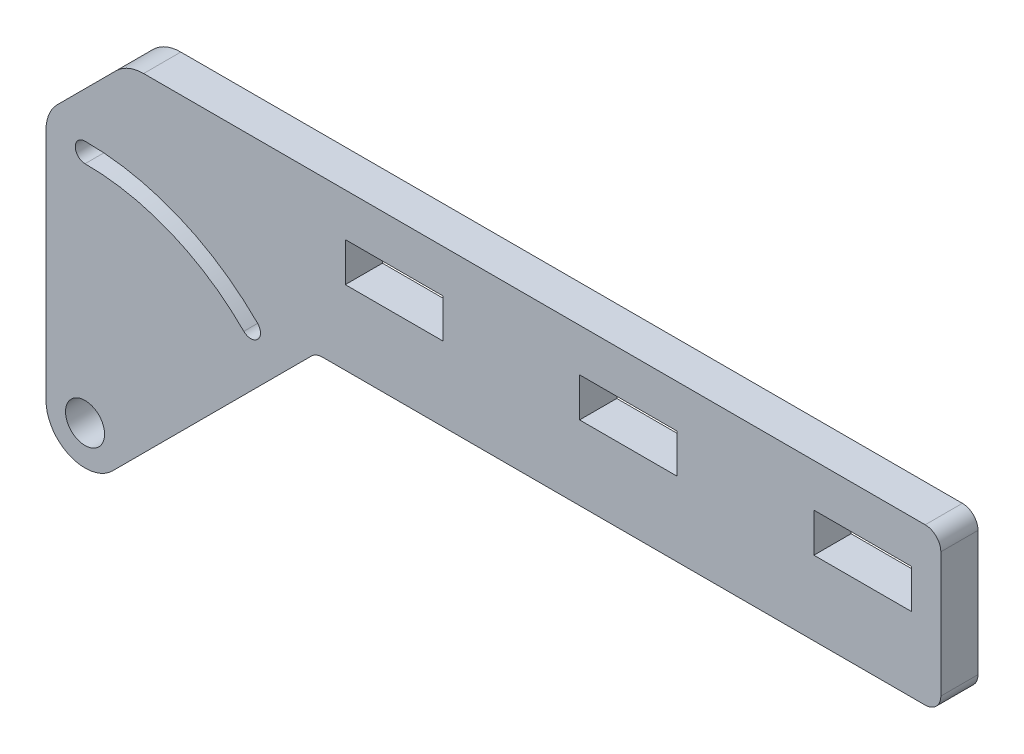
ISO-10303-21;
HEADER;
FILE_DESCRIPTION(('STEP AP214'),'2;1');
FILE_NAME('part.step','',(''),(''),'','','');
FILE_SCHEMA(('AUTOMOTIVE_DESIGN { 1 0 10303 214 1 1 1 1 }'));
ENDSEC;
DATA;
#1=APPLICATION_CONTEXT('core data for automotive mechanical design processes');
#2=APPLICATION_PROTOCOL_DEFINITION('international standard','automotive_design',2000,#1);
#3=PRODUCT_CONTEXT('',#1,'mechanical');
#4=PRODUCT('Part','Part','',(#3));
#5=PRODUCT_RELATED_PRODUCT_CATEGORY('part','',(#4));
#6=PRODUCT_DEFINITION_FORMATION('','',#4);
#7=PRODUCT_DEFINITION_CONTEXT('part definition',#1,'design');
#8=PRODUCT_DEFINITION('design','',#6,#7);
#9=PRODUCT_DEFINITION_SHAPE('','',#8);
#10=(LENGTH_UNIT() NAMED_UNIT(*) SI_UNIT(.MILLI.,.METRE.));
#11=(NAMED_UNIT(*) PLANE_ANGLE_UNIT() SI_UNIT($,.RADIAN.));
#12=(NAMED_UNIT(*) SI_UNIT($,.STERADIAN.) SOLID_ANGLE_UNIT());
#13=UNCERTAINTY_MEASURE_WITH_UNIT(LENGTH_MEASURE(1.E-05),#10,'distance_accuracy_value','');
#14=(GEOMETRIC_REPRESENTATION_CONTEXT(3) GLOBAL_UNCERTAINTY_ASSIGNED_CONTEXT((#13)) GLOBAL_UNIT_ASSIGNED_CONTEXT((#10,
#11,#12)) REPRESENTATION_CONTEXT('',''));
#15=CARTESIAN_POINT('',(0.,0.,0.));
#16=DIRECTION('',(0.,0.,1.));
#17=DIRECTION('',(1.,0.,0.));
#18=AXIS2_PLACEMENT_3D('',#15,#16,#17);
#19=CARTESIAN_POINT('',(139.155256121069,0.,6.0452));
#20=DIRECTION('',(-1.,0.,0.));
#21=DIRECTION('',(0.,0.,1.));
#22=AXIS2_PLACEMENT_3D('',#19,#20,#21);
#23=PLANE('',#22);
#24=DIRECTION('',(0.,1.,0.));
#25=VECTOR('',#24,1.);
#26=CARTESIAN_POINT('',(139.155256121069,0.,0.));
#27=LINE('',#26,#25);
#28=CARTESIAN_POINT('',(139.155256121069,31.115,0.));
#29=VERTEX_POINT('',#28);
#30=CARTESIAN_POINT('',(139.155256121069,51.435,0.));
#31=VERTEX_POINT('',#30);
#32=EDGE_CURVE('E454',#29,#31,#27,.T.);
#33=ORIENTED_EDGE('',*,*,#32,.T.);
#34=DIRECTION('',(0.,0.,-1.));
#35=VECTOR('',#34,1.);
#36=CARTESIAN_POINT('',(139.155256121069,51.435,6.0452));
#37=LINE('',#36,#35);
#38=CARTESIAN_POINT('',(139.155256121069,51.435,6.0452));
#39=VERTEX_POINT('',#38);
#40=EDGE_CURVE('E11',#39,#31,#37,.T.);
#41=ORIENTED_EDGE('',*,*,#40,.F.);
#42=DIRECTION('',(0.,1.,0.));
#43=VECTOR('',#42,1.);
#44=CARTESIAN_POINT('',(139.155256121069,0.,6.0452));
#45=LINE('',#44,#43);
#46=CARTESIAN_POINT('',(139.155256121069,31.115,6.0452));
#47=VERTEX_POINT('',#46);
#48=EDGE_CURVE('E393',#47,#39,#45,.T.);
#49=ORIENTED_EDGE('',*,*,#48,.F.);
#50=DIRECTION('',(0.,0.,-1.));
#51=VECTOR('',#50,1.);
#52=CARTESIAN_POINT('',(139.155256121069,31.115,6.0452));
#53=LINE('',#52,#51);
#54=EDGE_CURVE('E496',#47,#29,#53,.T.);
#55=ORIENTED_EDGE('',*,*,#54,.T.);
#56=EDGE_LOOP('',(#33,#41,#49,#55));
#57=FACE_BOUND('',#56,.T.);
#58=ADVANCED_FACE('F47',(#57),#23,.F.);
#59=CARTESIAN_POINT('',(136.615256121069,51.435,6.0452));
#60=DIRECTION('',(0.,0.,-1.));
#61=DIRECTION('',(-1.,0.,0.));
#62=AXIS2_PLACEMENT_3D('',#59,#60,#61);
#63=CYLINDRICAL_SURFACE('',#62,2.53999999999999);
#64=CARTESIAN_POINT('',(136.615256121069,51.435,0.));
#65=DIRECTION('',(0.,0.,1.));
#66=DIRECTION('',(1.,0.,0.));
#67=AXIS2_PLACEMENT_3D('',#64,#65,#66);
#68=CIRCLE('',#67,2.53999999999999);
#69=CARTESIAN_POINT('',(136.615256121069,53.975,0.));
#70=VERTEX_POINT('',#69);
#71=EDGE_CURVE('E458',#31,#70,#68,.T.);
#72=ORIENTED_EDGE('',*,*,#71,.T.);
#73=DIRECTION('',(0.,0.,-1.));
#74=VECTOR('',#73,1.);
#75=CARTESIAN_POINT('',(136.615256121069,53.975,6.0452));
#76=LINE('',#75,#74);
#77=CARTESIAN_POINT('',(136.615256121069,53.975,6.0452));
#78=VERTEX_POINT('',#77);
#79=EDGE_CURVE('E57',#78,#70,#76,.T.);
#80=ORIENTED_EDGE('',*,*,#79,.F.);
#81=CARTESIAN_POINT('',(136.615256121069,51.435,6.0452));
#82=DIRECTION('',(0.,0.,1.));
#83=DIRECTION('',(1.,0.,0.));
#84=AXIS2_PLACEMENT_3D('',#81,#82,#83);
#85=CIRCLE('',#84,2.53999999999999);
#86=EDGE_CURVE('E397',#39,#78,#85,.T.);
#87=ORIENTED_EDGE('',*,*,#86,.F.);
#88=ORIENTED_EDGE('',*,*,#40,.T.);
#89=EDGE_LOOP('',(#72,#80,#87,#88));
#90=FACE_BOUND('',#89,.T.);
#91=ADVANCED_FACE('F574',(#90),#63,.T.);
#92=CARTESIAN_POINT('',(0.,53.975,6.0452));
#93=DIRECTION('',(0.,-1.,0.));
#94=DIRECTION('',(1.,0.,0.));
#95=AXIS2_PLACEMENT_3D('',#92,#93,#94);
#96=PLANE('',#95);
#97=DIRECTION('',(-1.,0.,0.));
#98=VECTOR('',#97,1.);
#99=CARTESIAN_POINT('',(0.,53.975,0.));
#100=LINE('',#99,#98);
#101=CARTESIAN_POINT('',(9.52500000000008,53.975,0.));
#102=VERTEX_POINT('',#101);
#103=EDGE_CURVE('E461',#70,#102,#100,.T.);
#104=ORIENTED_EDGE('',*,*,#103,.T.);
#105=DIRECTION('',(0.,0.,-1.));
#106=VECTOR('',#105,1.);
#107=CARTESIAN_POINT('',(9.52500000000008,53.975,6.0452));
#108=LINE('',#107,#106);
#109=CARTESIAN_POINT('',(9.52500000000008,53.975,6.0452));
#110=VERTEX_POINT('',#109);
#111=EDGE_CURVE('E527',#110,#102,#108,.T.);
#112=ORIENTED_EDGE('',*,*,#111,.F.);
#113=DIRECTION('',(-1.,0.,0.));
#114=VECTOR('',#113,1.);
#115=CARTESIAN_POINT('',(0.,53.975,6.0452));
#116=LINE('',#115,#114);
#117=EDGE_CURVE('E400',#78,#110,#116,.T.);
#118=ORIENTED_EDGE('',*,*,#117,.F.);
#119=ORIENTED_EDGE('',*,*,#79,.T.);
#120=EDGE_LOOP('',(#104,#112,#118,#119));
#121=FACE_BOUND('',#120,.T.);
#122=ADVANCED_FACE('F579',(#121),#96,.F.);
#123=CARTESIAN_POINT('',(9.52500000000007,47.625,6.0452));
#124=DIRECTION('',(0.,0.,-1.));
#125=DIRECTION('',(-1.,0.,0.));
#126=AXIS2_PLACEMENT_3D('',#123,#124,#125);
#127=CYLINDRICAL_SURFACE('',#126,6.35);
#128=CARTESIAN_POINT('',(9.52500000000007,47.625,0.));
#129=DIRECTION('',(0.,0.,1.));
#130=DIRECTION('',(1.,0.,0.));
#131=AXIS2_PLACEMENT_3D('',#128,#129,#130);
#132=CIRCLE('',#131,6.35);
#133=CARTESIAN_POINT('',(5.03487193946552,52.1151280605346,0.));
#134=VERTEX_POINT('',#133);
#135=EDGE_CURVE('E465',#134,#102,#132,.F.);
#136=ORIENTED_EDGE('',*,*,#135,.F.);
#137=DIRECTION('',(0.,0.,-1.));
#138=VECTOR('',#137,1.);
#139=CARTESIAN_POINT('',(5.03487193946552,52.1151280605346,6.0452));
#140=LINE('',#139,#138);
#141=CARTESIAN_POINT('',(5.03487193946552,52.1151280605346,6.0452));
#142=VERTEX_POINT('',#141);
#143=EDGE_CURVE('E524',#142,#134,#140,.T.);
#144=ORIENTED_EDGE('',*,*,#143,.F.);
#145=CARTESIAN_POINT('',(9.52500000000007,47.625,6.0452));
#146=DIRECTION('',(0.,0.,1.));
#147=DIRECTION('',(1.,0.,0.));
#148=AXIS2_PLACEMENT_3D('',#145,#146,#147);
#149=CIRCLE('',#148,6.35);
#150=EDGE_CURVE('E403',#142,#110,#149,.F.);
#151=ORIENTED_EDGE('',*,*,#150,.T.);
#152=ORIENTED_EDGE('',*,*,#111,.T.);
#153=EDGE_LOOP('',(#136,#144,#151,#152));
#154=FACE_BOUND('',#153,.T.);
#155=ADVANCED_FACE('F617',(#154),#127,.T.);
#156=CARTESIAN_POINT('',(-23.5401280605346,23.5401280605348,6.0452));
#157=DIRECTION('',(-0.707106781186544,0.707106781186551,0.));
#158=DIRECTION('',(-0.707106781186551,-0.707106781186544,0.));
#159=AXIS2_PLACEMENT_3D('',#156,#157,#158);
#160=PLANE('',#159);
#161=DIRECTION('',(0.707106781186551,0.707106781186544,0.));
#162=VECTOR('',#161,1.);
#163=CARTESIAN_POINT('',(-23.5401280605346,23.5401280605348,0.));
#164=LINE('',#163,#162);
#165=CARTESIAN_POINT('',(-4.49012806053456,42.5901280605346,0.));
#166=VERTEX_POINT('',#165);
#167=EDGE_CURVE('E469',#166,#134,#164,.T.);
#168=ORIENTED_EDGE('',*,*,#167,.F.);
#169=DIRECTION('',(0.,0.,-1.));
#170=VECTOR('',#169,1.);
#171=CARTESIAN_POINT('',(-4.49012806053456,42.5901280605346,6.0452));
#172=LINE('',#171,#170);
#173=CARTESIAN_POINT('',(-4.49012806053456,42.5901280605346,6.0452));
#174=VERTEX_POINT('',#173);
#175=EDGE_CURVE('E521',#174,#166,#172,.T.);
#176=ORIENTED_EDGE('',*,*,#175,.F.);
#177=DIRECTION('',(0.707106781186551,0.707106781186544,0.));
#178=VECTOR('',#177,1.);
#179=CARTESIAN_POINT('',(-23.5401280605346,23.5401280605348,6.0452));
#180=LINE('',#179,#178);
#181=EDGE_CURVE('E407',#174,#142,#180,.T.);
#182=ORIENTED_EDGE('',*,*,#181,.T.);
#183=ORIENTED_EDGE('',*,*,#143,.T.);
#184=EDGE_LOOP('',(#168,#176,#182,#183));
#185=FACE_BOUND('',#184,.T.);
#186=ADVANCED_FACE('F586',(#185),#160,.T.);
#187=CARTESIAN_POINT('',(0.,38.1,6.0452));
#188=DIRECTION('',(0.,0.,-1.));
#189=DIRECTION('',(-1.,0.,0.));
#190=AXIS2_PLACEMENT_3D('',#187,#188,#189);
#191=CYLINDRICAL_SURFACE('',#190,6.35);
#192=CARTESIAN_POINT('',(0.,38.1,0.));
#193=DIRECTION('',(0.,0.,1.));
#194=DIRECTION('',(1.,0.,0.));
#195=AXIS2_PLACEMENT_3D('',#192,#193,#194);
#196=CIRCLE('',#195,6.35);
#197=CARTESIAN_POINT('',(-6.35,38.1,0.));
#198=VERTEX_POINT('',#197);
#199=EDGE_CURVE('E473',#198,#166,#196,.F.);
#200=ORIENTED_EDGE('',*,*,#199,.F.);
#201=DIRECTION('',(0.,0.,-1.));
#202=VECTOR('',#201,1.);
#203=CARTESIAN_POINT('',(-6.35,38.1,6.0452));
#204=LINE('',#203,#202);
#205=CARTESIAN_POINT('',(-6.35,38.1,6.0452));
#206=VERTEX_POINT('',#205);
#207=EDGE_CURVE('E518',#206,#198,#204,.T.);
#208=ORIENTED_EDGE('',*,*,#207,.F.);
#209=CARTESIAN_POINT('',(0.,38.1,6.0452));
#210=DIRECTION('',(0.,0.,1.));
#211=DIRECTION('',(1.,0.,0.));
#212=AXIS2_PLACEMENT_3D('',#209,#210,#211);
#213=CIRCLE('',#212,6.35);
#214=EDGE_CURVE('E411',#206,#174,#213,.F.);
#215=ORIENTED_EDGE('',*,*,#214,.T.);
#216=ORIENTED_EDGE('',*,*,#175,.T.);
#217=EDGE_LOOP('',(#200,#208,#215,#216));
#218=FACE_BOUND('',#217,.T.);
#219=ADVANCED_FACE('F590',(#218),#191,.T.);
#220=CARTESIAN_POINT('',(-6.35,0.,6.0452));
#221=DIRECTION('',(1.,0.,0.));
#222=DIRECTION('',(0.,1.,0.));
#223=AXIS2_PLACEMENT_3D('',#220,#221,#222);
#224=PLANE('',#223);
#225=DIRECTION('',(0.,-1.,0.));
#226=VECTOR('',#225,1.);
#227=CARTESIAN_POINT('',(-6.35,0.,0.));
#228=LINE('',#227,#226);
#229=CARTESIAN_POINT('',(-6.35,0.,0.));
#230=VERTEX_POINT('',#229);
#231=EDGE_CURVE('E477',#198,#230,#228,.T.);
#232=ORIENTED_EDGE('',*,*,#231,.T.);
#233=DIRECTION('',(0.,0.,-1.));
#234=VECTOR('',#233,1.);
#235=CARTESIAN_POINT('',(-6.35,0.,6.0452));
#236=LINE('',#235,#234);
#237=CARTESIAN_POINT('',(-6.35,0.,6.0452));
#238=VERTEX_POINT('',#237);
#239=EDGE_CURVE('E514',#238,#230,#236,.T.);
#240=ORIENTED_EDGE('',*,*,#239,.F.);
#241=DIRECTION('',(0.,-1.,0.));
#242=VECTOR('',#241,1.);
#243=CARTESIAN_POINT('',(-6.35,0.,6.0452));
#244=LINE('',#243,#242);
#245=EDGE_CURVE('E415',#206,#238,#244,.T.);
#246=ORIENTED_EDGE('',*,*,#245,.F.);
#247=ORIENTED_EDGE('',*,*,#207,.T.);
#248=EDGE_LOOP('',(#232,#240,#246,#247));
#249=FACE_BOUND('',#248,.T.);
#250=ADVANCED_FACE('F596',(#249),#224,.F.);
#251=CARTESIAN_POINT('',(0.,0.,6.0452));
#252=DIRECTION('',(0.,0.,-1.));
#253=DIRECTION('',(-1.,0.,0.));
#254=AXIS2_PLACEMENT_3D('',#251,#252,#253);
#255=CYLINDRICAL_SURFACE('',#254,6.35);
#256=CARTESIAN_POINT('',(0.,0.,0.));
#257=DIRECTION('',(0.,0.,1.));
#258=DIRECTION('',(1.,0.,0.));
#259=AXIS2_PLACEMENT_3D('',#256,#257,#258);
#260=CIRCLE('',#259,6.35);
#261=CARTESIAN_POINT('',(4.49012806053458,-4.49012806053457,0.));
#262=VERTEX_POINT('',#261);
#263=EDGE_CURVE('E480',#230,#262,#260,.T.);
#264=ORIENTED_EDGE('',*,*,#263,.T.);
#265=DIRECTION('',(0.,0.,-1.));
#266=VECTOR('',#265,1.);
#267=CARTESIAN_POINT('',(4.49012806053458,-4.49012806053457,6.0452));
#268=LINE('',#267,#266);
#269=CARTESIAN_POINT('',(4.49012806053458,-4.49012806053457,6.0452));
#270=VERTEX_POINT('',#269);
#271=EDGE_CURVE('E510',#270,#262,#268,.T.);
#272=ORIENTED_EDGE('',*,*,#271,.F.);
#273=CARTESIAN_POINT('',(0.,0.,6.0452));
#274=DIRECTION('',(0.,0.,1.));
#275=DIRECTION('',(1.,0.,0.));
#276=AXIS2_PLACEMENT_3D('',#273,#274,#275);
#277=CIRCLE('',#276,6.35);
#278=EDGE_CURVE('E418',#238,#270,#277,.T.);
#279=ORIENTED_EDGE('',*,*,#278,.F.);
#280=ORIENTED_EDGE('',*,*,#239,.T.);
#281=EDGE_LOOP('',(#264,#272,#279,#280));
#282=FACE_BOUND('',#281,.T.);
#283=ADVANCED_FACE('F600',(#282),#255,.T.);
#284=CARTESIAN_POINT('',(4.49012806053458,-4.49012806053457,6.0452));
#285=DIRECTION('',(-0.707106781186549,0.707106781186546,0.));
#286=DIRECTION('',(-0.707106781186546,-0.707106781186549,0.));
#287=AXIS2_PLACEMENT_3D('',#284,#285,#286);
#288=PLANE('',#287);
#289=DIRECTION('',(0.707106781186546,0.707106781186549,0.));
#290=VECTOR('',#289,1.);
#291=CARTESIAN_POINT('',(4.49012806053458,-4.49012806053457,0.));
#292=LINE('',#291,#290);
#293=CARTESIAN_POINT('',(36.811307345283,27.8310512242138,0.));
#294=VERTEX_POINT('',#293);
#295=EDGE_CURVE('E483',#262,#294,#292,.T.);
#296=ORIENTED_EDGE('',*,*,#295,.T.);
#297=DIRECTION('',(0.,0.,-1.));
#298=VECTOR('',#297,1.);
#299=CARTESIAN_POINT('',(36.811307345283,27.8310512242138,6.0452));
#300=LINE('',#299,#298);
#301=CARTESIAN_POINT('',(36.811307345283,27.8310512242138,6.0452));
#302=VERTEX_POINT('',#301);
#303=EDGE_CURVE('E507',#302,#294,#300,.T.);
#304=ORIENTED_EDGE('',*,*,#303,.F.);
#305=DIRECTION('',(0.707106781186546,0.707106781186549,0.));
#306=VECTOR('',#305,1.);
#307=CARTESIAN_POINT('',(4.49012806053458,-4.49012806053457,6.0452));
#308=LINE('',#307,#306);
#309=EDGE_CURVE('E421',#270,#302,#308,.T.);
#310=ORIENTED_EDGE('',*,*,#309,.F.);
#311=ORIENTED_EDGE('',*,*,#271,.T.);
#312=EDGE_LOOP('',(#296,#304,#310,#311));
#313=FACE_BOUND('',#312,.T.);
#314=ADVANCED_FACE('F605',(#313),#288,.F.);
#315=CARTESIAN_POINT('',(38.6073585694968,26.035,6.0452));
#316=DIRECTION('',(0.,0.,-1.));
#317=DIRECTION('',(-1.,0.,0.));
#318=AXIS2_PLACEMENT_3D('',#315,#316,#317);
#319=CYLINDRICAL_SURFACE('',#318,2.54);
#320=CARTESIAN_POINT('',(38.6073585694968,26.035,0.));
#321=DIRECTION('',(0.,0.,1.));
#322=DIRECTION('',(1.,0.,0.));
#323=AXIS2_PLACEMENT_3D('',#320,#321,#322);
#324=CIRCLE('',#323,2.54);
#325=CARTESIAN_POINT('',(38.6073585694968,28.575,0.));
#326=VERTEX_POINT('',#325);
#327=EDGE_CURVE('E487',#326,#294,#324,.T.);
#328=ORIENTED_EDGE('',*,*,#327,.F.);
#329=DIRECTION('',(0.,0.,-1.));
#330=VECTOR('',#329,1.);
#331=CARTESIAN_POINT('',(38.6073585694968,28.575,6.0452));
#332=LINE('',#331,#330);
#333=CARTESIAN_POINT('',(38.6073585694968,28.575,6.0452));
#334=VERTEX_POINT('',#333);
#335=EDGE_CURVE('E504',#334,#326,#332,.T.);
#336=ORIENTED_EDGE('',*,*,#335,.F.);
#337=CARTESIAN_POINT('',(38.6073585694968,26.035,6.0452));
#338=DIRECTION('',(0.,0.,1.));
#339=DIRECTION('',(1.,0.,0.));
#340=AXIS2_PLACEMENT_3D('',#337,#338,#339);
#341=CIRCLE('',#340,2.54);
#342=EDGE_CURVE('E424',#334,#302,#341,.T.);
#343=ORIENTED_EDGE('',*,*,#342,.T.);
#344=ORIENTED_EDGE('',*,*,#303,.T.);
#345=EDGE_LOOP('',(#328,#336,#343,#344));
#346=FACE_BOUND('',#345,.T.);
#347=ADVANCED_FACE('F611',(#346),#319,.F.);
#348=CARTESIAN_POINT('',(0.,28.575,6.0452));
#349=DIRECTION('',(0.,1.,0.));
#350=DIRECTION('',(0.,0.,1.));
#351=AXIS2_PLACEMENT_3D('',#348,#349,#350);
#352=PLANE('',#351);
#353=DIRECTION('',(1.,0.,0.));
#354=VECTOR('',#353,1.);
#355=CARTESIAN_POINT('',(0.,28.575,0.));
#356=LINE('',#355,#354);
#357=CARTESIAN_POINT('',(136.615256121069,28.575,0.));
#358=VERTEX_POINT('',#357);
#359=EDGE_CURVE('E491',#326,#358,#356,.T.);
#360=ORIENTED_EDGE('',*,*,#359,.T.);
#361=DIRECTION('',(0.,0.,-1.));
#362=VECTOR('',#361,1.);
#363=CARTESIAN_POINT('',(136.615256121069,28.575,6.0452));
#364=LINE('',#363,#362);
#365=CARTESIAN_POINT('',(136.615256121069,28.575,6.0452));
#366=VERTEX_POINT('',#365);
#367=EDGE_CURVE('E500',#366,#358,#364,.T.);
#368=ORIENTED_EDGE('',*,*,#367,.F.);
#369=DIRECTION('',(1.,0.,0.));
#370=VECTOR('',#369,1.);
#371=CARTESIAN_POINT('',(0.,28.575,6.0452));
#372=LINE('',#371,#370);
#373=EDGE_CURVE('E428',#334,#366,#372,.T.);
#374=ORIENTED_EDGE('',*,*,#373,.F.);
#375=ORIENTED_EDGE('',*,*,#335,.T.);
#376=EDGE_LOOP('',(#360,#368,#374,#375));
#377=FACE_BOUND('',#376,.T.);
#378=ADVANCED_FACE('F614',(#377),#352,.F.);
#379=CARTESIAN_POINT('',(0.,38.1,6.0452));
#380=DIRECTION('',(0.,0.,-1.));
#381=DIRECTION('',(-1.,0.,0.));
#382=AXIS2_PLACEMENT_3D('',#379,#380,#381);
#383=CYLINDRICAL_SURFACE('',#382,1.58750000000001);
#384=CARTESIAN_POINT('',(0.,38.1,0.));
#385=DIRECTION('',(0.,0.,1.));
#386=DIRECTION('',(1.,0.,0.));
#387=AXIS2_PLACEMENT_3D('',#384,#385,#386);
#388=CIRCLE('',#387,1.58750000000001);
#389=CARTESIAN_POINT('',(0.,39.6875,0.));
#390=VERTEX_POINT('',#389);
#391=CARTESIAN_POINT('',(0.,36.5125,0.));
#392=VERTEX_POINT('',#391);
#393=EDGE_CURVE('E438',#390,#392,#388,.T.);
#394=ORIENTED_EDGE('',*,*,#393,.F.);
#395=DIRECTION('',(0.,0.,-1.));
#396=VECTOR('',#395,1.);
#397=CARTESIAN_POINT('',(0.,39.6875,6.0452));
#398=LINE('',#397,#396);
#399=CARTESIAN_POINT('',(0.,39.6875,6.0452));
#400=VERTEX_POINT('',#399);
#401=EDGE_CURVE('E51',#400,#390,#398,.T.);
#402=ORIENTED_EDGE('',*,*,#401,.F.);
#403=CARTESIAN_POINT('',(0.,38.1,6.0452));
#404=DIRECTION('',(0.,0.,1.));
#405=DIRECTION('',(1.,0.,0.));
#406=AXIS2_PLACEMENT_3D('',#403,#404,#405);
#407=CIRCLE('',#406,1.58750000000001);
#408=CARTESIAN_POINT('',(0.,36.5125,6.0452));
#409=VERTEX_POINT('',#408);
#410=EDGE_CURVE('E377',#400,#409,#407,.T.);
#411=ORIENTED_EDGE('',*,*,#410,.T.);
#412=DIRECTION('',(0.,0.,-1.));
#413=VECTOR('',#412,1.);
#414=CARTESIAN_POINT('',(0.,36.5125,6.0452));
#415=LINE('',#414,#413);
#416=EDGE_CURVE('E434',#409,#392,#415,.T.);
#417=ORIENTED_EDGE('',*,*,#416,.T.);
#418=EDGE_LOOP('',(#394,#402,#411,#417));
#419=FACE_BOUND('',#418,.T.);
#420=ADVANCED_FACE('F549',(#419),#383,.F.);
#421=CARTESIAN_POINT('',(0.,0.,6.0452));
#422=DIRECTION('',(0.,0.,-1.));
#423=DIRECTION('',(-1.,0.,0.));
#424=AXIS2_PLACEMENT_3D('',#421,#422,#423);
#425=CYLINDRICAL_SURFACE('',#424,39.6875);
#426=CARTESIAN_POINT('',(0.,0.,0.));
#427=DIRECTION('',(0.,0.,1.));
#428=DIRECTION('',(1.,0.,0.));
#429=AXIS2_PLACEMENT_3D('',#426,#427,#428);
#430=CIRCLE('',#429,39.6875);
#431=CARTESIAN_POINT('',(28.0633003783411,28.0633003783412,0.));
#432=VERTEX_POINT('',#431);
#433=EDGE_CURVE('E442',#432,#390,#430,.T.);
#434=ORIENTED_EDGE('',*,*,#433,.F.);
#435=DIRECTION('',(0.,0.,-1.));
#436=VECTOR('',#435,1.);
#437=CARTESIAN_POINT('',(28.0633003783411,28.0633003783412,6.0452));
#438=LINE('',#437,#436);
#439=CARTESIAN_POINT('',(28.0633003783411,28.0633003783412,6.0452));
#440=VERTEX_POINT('',#439);
#441=EDGE_CURVE('E537',#440,#432,#438,.T.);
#442=ORIENTED_EDGE('',*,*,#441,.F.);
#443=CARTESIAN_POINT('',(0.,0.,6.0452));
#444=DIRECTION('',(0.,0.,1.));
#445=DIRECTION('',(1.,0.,0.));
#446=AXIS2_PLACEMENT_3D('',#443,#444,#445);
#447=CIRCLE('',#446,39.6875);
#448=EDGE_CURVE('E382',#440,#400,#447,.T.);
#449=ORIENTED_EDGE('',*,*,#448,.T.);
#450=ORIENTED_EDGE('',*,*,#401,.T.);
#451=EDGE_LOOP('',(#434,#442,#449,#450));
#452=FACE_BOUND('',#451,.T.);
#453=ADVANCED_FACE('F545',(#452),#425,.F.);
#454=CARTESIAN_POINT('',(26.9407683632074,26.9407683632075,6.0452));
#455=DIRECTION('',(0.,0.,-1.));
#456=DIRECTION('',(-1.,0.,0.));
#457=AXIS2_PLACEMENT_3D('',#454,#455,#456);
#458=CYLINDRICAL_SURFACE('',#457,1.5875);
#459=CARTESIAN_POINT('',(26.9407683632074,26.9407683632075,0.));
#460=DIRECTION('',(0.,0.,1.));
#461=DIRECTION('',(1.,0.,0.));
#462=AXIS2_PLACEMENT_3D('',#459,#460,#461);
#463=CIRCLE('',#462,1.5875);
#464=CARTESIAN_POINT('',(25.8182363480738,25.8182363480739,0.));
#465=VERTEX_POINT('',#464);
#466=EDGE_CURVE('E446',#465,#432,#463,.T.);
#467=ORIENTED_EDGE('',*,*,#466,.F.);
#468=DIRECTION('',(0.,0.,-1.));
#469=VECTOR('',#468,1.);
#470=CARTESIAN_POINT('',(25.8182363480738,25.8182363480739,6.0452));
#471=LINE('',#470,#469);
#472=CARTESIAN_POINT('',(25.8182363480738,25.8182363480739,6.0452));
#473=VERTEX_POINT('',#472);
#474=EDGE_CURVE('E535',#473,#465,#471,.T.);
#475=ORIENTED_EDGE('',*,*,#474,.F.);
#476=CARTESIAN_POINT('',(26.9407683632074,26.9407683632075,6.0452));
#477=DIRECTION('',(0.,0.,1.));
#478=DIRECTION('',(1.,0.,0.));
#479=AXIS2_PLACEMENT_3D('',#476,#477,#478);
#480=CIRCLE('',#479,1.5875);
#481=EDGE_CURVE('E386',#473,#440,#480,.T.);
#482=ORIENTED_EDGE('',*,*,#481,.T.);
#483=ORIENTED_EDGE('',*,*,#441,.T.);
#484=EDGE_LOOP('',(#467,#475,#482,#483));
#485=FACE_BOUND('',#484,.T.);
#486=ADVANCED_FACE('F554',(#485),#458,.F.);
#487=CARTESIAN_POINT('',(0.,0.,6.0452));
#488=DIRECTION('',(0.,0.,-1.));
#489=DIRECTION('',(-1.,0.,0.));
#490=AXIS2_PLACEMENT_3D('',#487,#488,#489);
#491=CYLINDRICAL_SURFACE('',#490,36.5125);
#492=CARTESIAN_POINT('',(0.,0.,0.));
#493=DIRECTION('',(0.,0.,1.));
#494=DIRECTION('',(1.,0.,0.));
#495=AXIS2_PLACEMENT_3D('',#492,#493,#494);
#496=CIRCLE('',#495,36.5125);
#497=EDGE_CURVE('E450',#465,#392,#496,.T.);
#498=ORIENTED_EDGE('',*,*,#497,.T.);
#499=ORIENTED_EDGE('',*,*,#416,.F.);
#500=CARTESIAN_POINT('',(0.,0.,6.0452));
#501=DIRECTION('',(0.,0.,1.));
#502=DIRECTION('',(1.,0.,0.));
#503=AXIS2_PLACEMENT_3D('',#500,#501,#502);
#504=CIRCLE('',#503,36.5125);
#505=EDGE_CURVE('E390',#473,#409,#504,.T.);
#506=ORIENTED_EDGE('',*,*,#505,.F.);
#507=ORIENTED_EDGE('',*,*,#474,.T.);
#508=EDGE_LOOP('',(#498,#499,#506,#507));
#509=FACE_BOUND('',#508,.T.);
#510=ADVANCED_FACE('F558',(#509),#491,.T.);
#511=CARTESIAN_POINT('',(0.,0.,6.0452));
#512=DIRECTION('',(0.,0.,-1.));
#513=DIRECTION('',(-1.,0.,0.));
#514=AXIS2_PLACEMENT_3D('',#511,#512,#513);
#515=CYLINDRICAL_SURFACE('',#514,3.175);
#516=CARTESIAN_POINT('',(0.,0.,6.0452));
#517=DIRECTION('',(0.,0.,1.));
#518=DIRECTION('',(1.,0.,0.));
#519=AXIS2_PLACEMENT_3D('',#516,#517,#518);
#520=CIRCLE('',#519,3.175);
#521=CARTESIAN_POINT('',(3.175,0.,6.0452));
#522=VERTEX_POINT('',#521);
#523=EDGE_CURVE('E373',#522,#522,#520,.T.);
#524=ORIENTED_EDGE('',*,*,#523,.T.);
#525=EDGE_LOOP('',(#524));
#526=FACE_BOUND('',#525,.T.);
#527=CARTESIAN_POINT('',(0.,0.,0.));
#528=DIRECTION('',(0.,0.,1.));
#529=DIRECTION('',(1.,0.,0.));
#530=AXIS2_PLACEMENT_3D('',#527,#528,#529);
#531=CIRCLE('',#530,3.175);
#532=CARTESIAN_POINT('',(3.175,0.,0.));
#533=VERTEX_POINT('',#532);
#534=EDGE_CURVE('E281',#533,#533,#531,.T.);
#535=ORIENTED_EDGE('',*,*,#534,.F.);
#536=EDGE_LOOP('',(#535));
#537=FACE_BOUND('',#536,.T.);
#538=ADVANCED_FACE('F49',(#526,#537),#515,.F.);
#539=CARTESIAN_POINT('',(136.615256121069,31.115,6.0452));
#540=DIRECTION('',(0.,0.,-1.));
#541=DIRECTION('',(-1.,0.,0.));
#542=AXIS2_PLACEMENT_3D('',#539,#540,#541);
#543=CYLINDRICAL_SURFACE('',#542,2.53999999999999);
#544=CARTESIAN_POINT('',(136.615256121069,31.115,0.));
#545=DIRECTION('',(0.,0.,1.));
#546=DIRECTION('',(1.,0.,0.));
#547=AXIS2_PLACEMENT_3D('',#544,#545,#546);
#548=CIRCLE('',#547,2.53999999999999);
#549=EDGE_CURVE('E378',#358,#29,#548,.T.);
#550=ORIENTED_EDGE('',*,*,#549,.T.);
#551=ORIENTED_EDGE('',*,*,#54,.F.);
#552=CARTESIAN_POINT('',(136.615256121069,31.115,6.0452));
#553=DIRECTION('',(0.,0.,1.));
#554=DIRECTION('',(1.,0.,0.));
#555=AXIS2_PLACEMENT_3D('',#552,#553,#554);
#556=CIRCLE('',#555,2.53999999999999);
#557=EDGE_CURVE('E431',#366,#47,#556,.T.);
#558=ORIENTED_EDGE('',*,*,#557,.F.);
#559=ORIENTED_EDGE('',*,*,#367,.T.);
#560=EDGE_LOOP('',(#550,#551,#558,#559));
#561=FACE_BOUND('',#560,.T.);
#562=ADVANCED_FACE('F563',(#561),#543,.T.);
#563=CARTESIAN_POINT('',(0.,0.,6.0452));
#564=DIRECTION('',(0.,0.,1.));
#565=DIRECTION('',(1.,0.,0.));
#566=AXIS2_PLACEMENT_3D('',#563,#564,#565);
#567=PLANE('',#566);
#568=DIRECTION('',(0.,-1.,0.));
#569=VECTOR('',#568,1.);
#570=CARTESIAN_POINT('',(118.517756121069,46.99,6.0452));
#571=LINE('',#570,#569);
#572=CARTESIAN_POINT('',(118.517756121069,46.99,6.0452));
#573=VERTEX_POINT('',#572);
#574=CARTESIAN_POINT('',(118.517756121069,40.64,6.0452));
#575=VERTEX_POINT('',#574);
#576=EDGE_CURVE('E65',#573,#575,#571,.T.);
#577=ORIENTED_EDGE('',*,*,#576,.F.);
#578=DIRECTION('',(-1.,0.,0.));
#579=VECTOR('',#578,1.);
#580=CARTESIAN_POINT('',(118.517756121069,46.99,6.0452));
#581=LINE('',#580,#579);
#582=CARTESIAN_POINT('',(134.392756121069,46.99,6.0452));
#583=VERTEX_POINT('',#582);
#584=EDGE_CURVE('E259',#583,#573,#581,.T.);
#585=ORIENTED_EDGE('',*,*,#584,.F.);
#586=DIRECTION('',(0.,1.,0.));
#587=VECTOR('',#586,1.);
#588=CARTESIAN_POINT('',(134.392756121069,46.99,6.0452));
#589=LINE('',#588,#587);
#590=CARTESIAN_POINT('',(134.392756121069,40.64,6.0452));
#591=VERTEX_POINT('',#590);
#592=EDGE_CURVE('E263',#591,#583,#589,.T.);
#593=ORIENTED_EDGE('',*,*,#592,.F.);
#594=DIRECTION('',(1.,0.,0.));
#595=VECTOR('',#594,1.);
#596=CARTESIAN_POINT('',(118.517756121069,40.64,6.0452));
#597=LINE('',#596,#595);
#598=EDGE_CURVE('E272',#575,#591,#597,.T.);
#599=ORIENTED_EDGE('',*,*,#598,.F.);
#600=EDGE_LOOP('',(#577,#585,#593,#599));
#601=FACE_BOUND('',#600,.T.);
#602=DIRECTION('',(-1.,0.,0.));
#603=VECTOR('',#602,1.);
#604=CARTESIAN_POINT('',(80.4177561210691,46.99,6.0452));
#605=LINE('',#604,#603);
#606=CARTESIAN_POINT('',(96.2927561210691,46.99,6.0452));
#607=VERTEX_POINT('',#606);
#608=CARTESIAN_POINT('',(80.4177561210691,46.99,6.0452));
#609=VERTEX_POINT('',#608);
#610=EDGE_CURVE('E73',#607,#609,#605,.T.);
#611=ORIENTED_EDGE('',*,*,#610,.F.);
#612=DIRECTION('',(0.,1.,0.));
#613=VECTOR('',#612,1.);
#614=CARTESIAN_POINT('',(96.2927561210691,46.99,6.0452));
#615=LINE('',#614,#613);
#616=CARTESIAN_POINT('',(96.2927561210691,40.64,6.0452));
#617=VERTEX_POINT('',#616);
#618=EDGE_CURVE('E301',#617,#607,#615,.T.);
#619=ORIENTED_EDGE('',*,*,#618,.F.);
#620=DIRECTION('',(1.,0.,0.));
#621=VECTOR('',#620,1.);
#622=CARTESIAN_POINT('',(80.4177561210691,40.64,6.0452));
#623=LINE('',#622,#621);
#624=CARTESIAN_POINT('',(80.4177561210691,40.64,6.0452));
#625=VERTEX_POINT('',#624);
#626=EDGE_CURVE('E305',#625,#617,#623,.T.);
#627=ORIENTED_EDGE('',*,*,#626,.F.);
#628=DIRECTION('',(0.,-1.,0.));
#629=VECTOR('',#628,1.);
#630=CARTESIAN_POINT('',(80.4177561210691,46.99,6.0452));
#631=LINE('',#630,#629);
#632=EDGE_CURVE('E310',#609,#625,#631,.T.);
#633=ORIENTED_EDGE('',*,*,#632,.F.);
#634=EDGE_LOOP('',(#611,#619,#627,#633));
#635=FACE_BOUND('',#634,.T.);
#636=DIRECTION('',(-1.,0.,0.));
#637=VECTOR('',#636,1.);
#638=CARTESIAN_POINT('',(42.3177561210691,46.99,6.0452));
#639=LINE('',#638,#637);
#640=CARTESIAN_POINT('',(58.1927561210691,46.99,6.0452));
#641=VERTEX_POINT('',#640);
#642=CARTESIAN_POINT('',(42.3177561210691,46.99,6.0452));
#643=VERTEX_POINT('',#642);
#644=EDGE_CURVE('E300',#641,#643,#639,.T.);
#645=ORIENTED_EDGE('',*,*,#644,.F.);
#646=DIRECTION('',(0.,1.,0.));
#647=VECTOR('',#646,1.);
#648=CARTESIAN_POINT('',(58.1927561210691,46.99,6.0452));
#649=LINE('',#648,#647);
#650=CARTESIAN_POINT('',(58.1927561210691,40.64,6.0452));
#651=VERTEX_POINT('',#650);
#652=EDGE_CURVE('E344',#651,#641,#649,.T.);
#653=ORIENTED_EDGE('',*,*,#652,.F.);
#654=DIRECTION('',(1.,0.,0.));
#655=VECTOR('',#654,1.);
#656=CARTESIAN_POINT('',(42.3177561210691,40.64,6.0452));
#657=LINE('',#656,#655);
#658=CARTESIAN_POINT('',(42.3177561210691,40.64,6.0452));
#659=VERTEX_POINT('',#658);
#660=EDGE_CURVE('E348',#659,#651,#657,.T.);
#661=ORIENTED_EDGE('',*,*,#660,.F.);
#662=DIRECTION('',(0.,-1.,0.));
#663=VECTOR('',#662,1.);
#664=CARTESIAN_POINT('',(42.3177561210691,46.99,6.0452));
#665=LINE('',#664,#663);
#666=EDGE_CURVE('E353',#643,#659,#665,.T.);
#667=ORIENTED_EDGE('',*,*,#666,.F.);
#668=EDGE_LOOP('',(#645,#653,#661,#667));
#669=FACE_BOUND('',#668,.T.);
#670=ORIENTED_EDGE('',*,*,#523,.F.);
#671=EDGE_LOOP('',(#670));
#672=FACE_BOUND('',#671,.T.);
#673=ORIENTED_EDGE('',*,*,#410,.F.);
#674=ORIENTED_EDGE('',*,*,#448,.F.);
#675=ORIENTED_EDGE('',*,*,#481,.F.);
#676=ORIENTED_EDGE('',*,*,#505,.T.);
#677=EDGE_LOOP('',(#673,#674,#675,#676));
#678=FACE_BOUND('',#677,.T.);
#679=ORIENTED_EDGE('',*,*,#48,.T.);
#680=ORIENTED_EDGE('',*,*,#86,.T.);
#681=ORIENTED_EDGE('',*,*,#117,.T.);
#682=ORIENTED_EDGE('',*,*,#150,.F.);
#683=ORIENTED_EDGE('',*,*,#181,.F.);
#684=ORIENTED_EDGE('',*,*,#214,.F.);
#685=ORIENTED_EDGE('',*,*,#245,.T.);
#686=ORIENTED_EDGE('',*,*,#278,.T.);
#687=ORIENTED_EDGE('',*,*,#309,.T.);
#688=ORIENTED_EDGE('',*,*,#342,.F.);
#689=ORIENTED_EDGE('',*,*,#373,.T.);
#690=ORIENTED_EDGE('',*,*,#557,.T.);
#691=EDGE_LOOP('',(#679,#680,#681,#682,#683,#684,#685,#686,#687,#688,#689,#690));
#692=FACE_BOUND('',#691,.T.);
#693=ADVANCED_FACE('F560',(#601,#635,#669,#672,#678,#692),#567,.T.);
#694=CARTESIAN_POINT('',(0.,0.,0.));
#695=DIRECTION('',(0.,0.,1.));
#696=DIRECTION('',(1.,0.,0.));
#697=AXIS2_PLACEMENT_3D('',#694,#695,#696);
#698=PLANE('',#697);
#699=DIRECTION('',(-1.,0.,0.));
#700=VECTOR('',#699,1.);
#701=CARTESIAN_POINT('',(118.517756121069,46.99,0.));
#702=LINE('',#701,#700);
#703=CARTESIAN_POINT('',(134.392756121069,46.99,0.));
#704=VERTEX_POINT('',#703);
#705=CARTESIAN_POINT('',(118.517756121069,46.99,0.));
#706=VERTEX_POINT('',#705);
#707=EDGE_CURVE('E244',#704,#706,#702,.T.);
#708=ORIENTED_EDGE('',*,*,#707,.T.);
#709=DIRECTION('',(0.,-1.,0.));
#710=VECTOR('',#709,1.);
#711=CARTESIAN_POINT('',(118.517756121069,46.99,0.));
#712=LINE('',#711,#710);
#713=CARTESIAN_POINT('',(118.517756121069,40.64,0.));
#714=VERTEX_POINT('',#713);
#715=EDGE_CURVE('E237',#706,#714,#712,.T.);
#716=ORIENTED_EDGE('',*,*,#715,.T.);
#717=DIRECTION('',(1.,0.,0.));
#718=VECTOR('',#717,1.);
#719=CARTESIAN_POINT('',(118.517756121069,40.64,0.));
#720=LINE('',#719,#718);
#721=CARTESIAN_POINT('',(134.392756121069,40.64,0.));
#722=VERTEX_POINT('',#721);
#723=EDGE_CURVE('E248',#714,#722,#720,.T.);
#724=ORIENTED_EDGE('',*,*,#723,.T.);
#725=DIRECTION('',(0.,1.,0.));
#726=VECTOR('',#725,1.);
#727=CARTESIAN_POINT('',(134.392756121069,46.99,0.));
#728=LINE('',#727,#726);
#729=EDGE_CURVE('E253',#722,#704,#728,.T.);
#730=ORIENTED_EDGE('',*,*,#729,.T.);
#731=EDGE_LOOP('',(#708,#716,#724,#730));
#732=FACE_BOUND('',#731,.T.);
#733=DIRECTION('',(0.,1.,0.));
#734=VECTOR('',#733,1.);
#735=CARTESIAN_POINT('',(96.2927561210691,46.99,0.));
#736=LINE('',#735,#734);
#737=CARTESIAN_POINT('',(96.2927561210691,40.64,0.));
#738=VERTEX_POINT('',#737);
#739=CARTESIAN_POINT('',(96.2927561210691,46.99,0.));
#740=VERTEX_POINT('',#739);
#741=EDGE_CURVE('E290',#738,#740,#736,.T.);
#742=ORIENTED_EDGE('',*,*,#741,.T.);
#743=DIRECTION('',(-1.,0.,0.));
#744=VECTOR('',#743,1.);
#745=CARTESIAN_POINT('',(80.4177561210691,46.99,0.));
#746=LINE('',#745,#744);
#747=CARTESIAN_POINT('',(80.4177561210691,46.99,0.));
#748=VERTEX_POINT('',#747);
#749=EDGE_CURVE('E306',#740,#748,#746,.T.);
#750=ORIENTED_EDGE('',*,*,#749,.T.);
#751=DIRECTION('',(0.,-1.,0.));
#752=VECTOR('',#751,1.);
#753=CARTESIAN_POINT('',(80.4177561210691,46.99,0.));
#754=LINE('',#753,#752);
#755=CARTESIAN_POINT('',(80.4177561210691,40.64,0.));
#756=VERTEX_POINT('',#755);
#757=EDGE_CURVE('E323',#748,#756,#754,.T.);
#758=ORIENTED_EDGE('',*,*,#757,.T.);
#759=DIRECTION('',(1.,0.,0.));
#760=VECTOR('',#759,1.);
#761=CARTESIAN_POINT('',(80.4177561210691,40.64,0.));
#762=LINE('',#761,#760);
#763=EDGE_CURVE('E319',#756,#738,#762,.T.);
#764=ORIENTED_EDGE('',*,*,#763,.T.);
#765=EDGE_LOOP('',(#742,#750,#758,#764));
#766=FACE_BOUND('',#765,.T.);
#767=DIRECTION('',(0.,1.,0.));
#768=VECTOR('',#767,1.);
#769=CARTESIAN_POINT('',(58.1927561210691,46.99,0.));
#770=LINE('',#769,#768);
#771=CARTESIAN_POINT('',(58.1927561210691,40.64,0.));
#772=VERTEX_POINT('',#771);
#773=CARTESIAN_POINT('',(58.1927561210691,46.99,0.));
#774=VERTEX_POINT('',#773);
#775=EDGE_CURVE('E334',#772,#774,#770,.T.);
#776=ORIENTED_EDGE('',*,*,#775,.T.);
#777=DIRECTION('',(-1.,0.,0.));
#778=VECTOR('',#777,1.);
#779=CARTESIAN_POINT('',(42.3177561210691,46.99,0.));
#780=LINE('',#779,#778);
#781=CARTESIAN_POINT('',(42.3177561210691,46.99,0.));
#782=VERTEX_POINT('',#781);
#783=EDGE_CURVE('E349',#774,#782,#780,.T.);
#784=ORIENTED_EDGE('',*,*,#783,.T.);
#785=DIRECTION('',(0.,-1.,0.));
#786=VECTOR('',#785,1.);
#787=CARTESIAN_POINT('',(42.3177561210691,46.99,0.));
#788=LINE('',#787,#786);
#789=CARTESIAN_POINT('',(42.3177561210691,40.64,0.));
#790=VERTEX_POINT('',#789);
#791=EDGE_CURVE('E366',#782,#790,#788,.T.);
#792=ORIENTED_EDGE('',*,*,#791,.T.);
#793=DIRECTION('',(1.,0.,0.));
#794=VECTOR('',#793,1.);
#795=CARTESIAN_POINT('',(42.3177561210691,40.64,0.));
#796=LINE('',#795,#794);
#797=EDGE_CURVE('E362',#790,#772,#796,.T.);
#798=ORIENTED_EDGE('',*,*,#797,.T.);
#799=EDGE_LOOP('',(#776,#784,#792,#798));
#800=FACE_BOUND('',#799,.T.);
#801=ORIENTED_EDGE('',*,*,#534,.T.);
#802=EDGE_LOOP('',(#801));
#803=FACE_BOUND('',#802,.T.);
#804=ORIENTED_EDGE('',*,*,#393,.T.);
#805=ORIENTED_EDGE('',*,*,#497,.F.);
#806=ORIENTED_EDGE('',*,*,#466,.T.);
#807=ORIENTED_EDGE('',*,*,#433,.T.);
#808=EDGE_LOOP('',(#804,#805,#806,#807));
#809=FACE_BOUND('',#808,.T.);
#810=ORIENTED_EDGE('',*,*,#32,.F.);
#811=ORIENTED_EDGE('',*,*,#549,.F.);
#812=ORIENTED_EDGE('',*,*,#359,.F.);
#813=ORIENTED_EDGE('',*,*,#327,.T.);
#814=ORIENTED_EDGE('',*,*,#295,.F.);
#815=ORIENTED_EDGE('',*,*,#263,.F.);
#816=ORIENTED_EDGE('',*,*,#231,.F.);
#817=ORIENTED_EDGE('',*,*,#199,.T.);
#818=ORIENTED_EDGE('',*,*,#167,.T.);
#819=ORIENTED_EDGE('',*,*,#135,.T.);
#820=ORIENTED_EDGE('',*,*,#103,.F.);
#821=ORIENTED_EDGE('',*,*,#71,.F.);
#822=EDGE_LOOP('',(#810,#811,#812,#813,#814,#815,#816,#817,#818,#819,#820,#821));
#823=FACE_BOUND('',#822,.T.);
#824=ADVANCED_FACE('F255',(#732,#766,#800,#803,#809,#823),#698,.F.);
#825=CARTESIAN_POINT('',(42.3177561210691,46.99,0.));
#826=DIRECTION('',(0.,1.,0.));
#827=DIRECTION('',(0.,0.,1.));
#828=AXIS2_PLACEMENT_3D('',#825,#826,#827);
#829=PLANE('',#828);
#830=ORIENTED_EDGE('',*,*,#644,.T.);
#831=DIRECTION('',(0.,0.,1.));
#832=VECTOR('',#831,1.);
#833=CARTESIAN_POINT('',(42.3177561210691,46.99,0.));
#834=LINE('',#833,#832);
#835=EDGE_CURVE('E330',#782,#643,#834,.T.);
#836=ORIENTED_EDGE('',*,*,#835,.F.);
#837=ORIENTED_EDGE('',*,*,#783,.F.);
#838=DIRECTION('',(0.,0.,1.));
#839=VECTOR('',#838,1.);
#840=CARTESIAN_POINT('',(58.1927561210691,46.99,0.));
#841=LINE('',#840,#839);
#842=EDGE_CURVE('E341',#774,#641,#841,.T.);
#843=ORIENTED_EDGE('',*,*,#842,.T.);
#844=EDGE_LOOP('',(#830,#836,#837,#843));
#845=FACE_BOUND('',#844,.T.);
#846=ADVANCED_FACE('F739',(#845),#829,.F.);
#847=CARTESIAN_POINT('',(58.1927561210691,46.99,0.));
#848=DIRECTION('',(1.,0.,0.));
#849=DIRECTION('',(0.,0.,-1.));
#850=AXIS2_PLACEMENT_3D('',#847,#848,#849);
#851=PLANE('',#850);
#852=ORIENTED_EDGE('',*,*,#652,.T.);
#853=ORIENTED_EDGE('',*,*,#842,.F.);
#854=ORIENTED_EDGE('',*,*,#775,.F.);
#855=DIRECTION('',(0.,0.,1.));
#856=VECTOR('',#855,1.);
#857=CARTESIAN_POINT('',(58.1927561210691,40.64,0.));
#858=LINE('',#857,#856);
#859=EDGE_CURVE('E338',#772,#651,#858,.T.);
#860=ORIENTED_EDGE('',*,*,#859,.T.);
#861=EDGE_LOOP('',(#852,#853,#854,#860));
#862=FACE_BOUND('',#861,.T.);
#863=ADVANCED_FACE('F747',(#862),#851,.F.);
#864=CARTESIAN_POINT('',(42.3177561210691,40.64,0.));
#865=DIRECTION('',(0.,-1.,0.));
#866=DIRECTION('',(0.,0.,-1.));
#867=AXIS2_PLACEMENT_3D('',#864,#865,#866);
#868=PLANE('',#867);
#869=ORIENTED_EDGE('',*,*,#660,.T.);
#870=ORIENTED_EDGE('',*,*,#859,.F.);
#871=ORIENTED_EDGE('',*,*,#797,.F.);
#872=DIRECTION('',(0.,0.,1.));
#873=VECTOR('',#872,1.);
#874=CARTESIAN_POINT('',(42.3177561210691,40.64,0.));
#875=LINE('',#874,#873);
#876=EDGE_CURVE('E335',#790,#659,#875,.T.);
#877=ORIENTED_EDGE('',*,*,#876,.T.);
#878=EDGE_LOOP('',(#869,#870,#871,#877));
#879=FACE_BOUND('',#878,.T.);
#880=ADVANCED_FACE('F757',(#879),#868,.F.);
#881=CARTESIAN_POINT('',(42.3177561210691,46.99,0.));
#882=DIRECTION('',(-1.,0.,0.));
#883=DIRECTION('',(0.,0.,1.));
#884=AXIS2_PLACEMENT_3D('',#881,#882,#883);
#885=PLANE('',#884);
#886=ORIENTED_EDGE('',*,*,#666,.T.);
#887=ORIENTED_EDGE('',*,*,#876,.F.);
#888=ORIENTED_EDGE('',*,*,#791,.F.);
#889=ORIENTED_EDGE('',*,*,#835,.T.);
#890=EDGE_LOOP('',(#886,#887,#888,#889));
#891=FACE_BOUND('',#890,.T.);
#892=ADVANCED_FACE('F767',(#891),#885,.F.);
#893=CARTESIAN_POINT('',(80.4177561210691,46.99,0.));
#894=DIRECTION('',(0.,1.,0.));
#895=DIRECTION('',(0.,0.,1.));
#896=AXIS2_PLACEMENT_3D('',#893,#894,#895);
#897=PLANE('',#896);
#898=ORIENTED_EDGE('',*,*,#610,.T.);
#899=DIRECTION('',(0.,0.,1.));
#900=VECTOR('',#899,1.);
#901=CARTESIAN_POINT('',(80.4177561210691,46.99,0.));
#902=LINE('',#901,#900);
#903=EDGE_CURVE('E287',#748,#609,#902,.T.);
#904=ORIENTED_EDGE('',*,*,#903,.F.);
#905=ORIENTED_EDGE('',*,*,#749,.F.);
#906=DIRECTION('',(0.,0.,1.));
#907=VECTOR('',#906,1.);
#908=CARTESIAN_POINT('',(96.2927561210691,46.99,0.));
#909=LINE('',#908,#907);
#910=EDGE_CURVE('E297',#740,#607,#909,.T.);
#911=ORIENTED_EDGE('',*,*,#910,.T.);
#912=EDGE_LOOP('',(#898,#904,#905,#911));
#913=FACE_BOUND('',#912,.T.);
#914=ADVANCED_FACE('F777',(#913),#897,.F.);
#915=CARTESIAN_POINT('',(96.2927561210691,46.99,0.));
#916=DIRECTION('',(1.,0.,0.));
#917=DIRECTION('',(0.,0.,-1.));
#918=AXIS2_PLACEMENT_3D('',#915,#916,#917);
#919=PLANE('',#918);
#920=ORIENTED_EDGE('',*,*,#618,.T.);
#921=ORIENTED_EDGE('',*,*,#910,.F.);
#922=ORIENTED_EDGE('',*,*,#741,.F.);
#923=DIRECTION('',(0.,0.,1.));
#924=VECTOR('',#923,1.);
#925=CARTESIAN_POINT('',(96.2927561210691,40.64,0.));
#926=LINE('',#925,#924);
#927=EDGE_CURVE('E294',#738,#617,#926,.T.);
#928=ORIENTED_EDGE('',*,*,#927,.T.);
#929=EDGE_LOOP('',(#920,#921,#922,#928));
#930=FACE_BOUND('',#929,.T.);
#931=ADVANCED_FACE('F787',(#930),#919,.F.);
#932=CARTESIAN_POINT('',(80.4177561210691,40.64,0.));
#933=DIRECTION('',(0.,-1.,0.));
#934=DIRECTION('',(0.,0.,-1.));
#935=AXIS2_PLACEMENT_3D('',#932,#933,#934);
#936=PLANE('',#935);
#937=ORIENTED_EDGE('',*,*,#626,.T.);
#938=ORIENTED_EDGE('',*,*,#927,.F.);
#939=ORIENTED_EDGE('',*,*,#763,.F.);
#940=DIRECTION('',(0.,0.,1.));
#941=VECTOR('',#940,1.);
#942=CARTESIAN_POINT('',(80.4177561210691,40.64,0.));
#943=LINE('',#942,#941);
#944=EDGE_CURVE('E291',#756,#625,#943,.T.);
#945=ORIENTED_EDGE('',*,*,#944,.T.);
#946=EDGE_LOOP('',(#937,#938,#939,#945));
#947=FACE_BOUND('',#946,.T.);
#948=ADVANCED_FACE('F796',(#947),#936,.F.);
#949=CARTESIAN_POINT('',(80.4177561210691,46.99,0.));
#950=DIRECTION('',(-1.,0.,0.));
#951=DIRECTION('',(0.,0.,1.));
#952=AXIS2_PLACEMENT_3D('',#949,#950,#951);
#953=PLANE('',#952);
#954=ORIENTED_EDGE('',*,*,#632,.T.);
#955=ORIENTED_EDGE('',*,*,#944,.F.);
#956=ORIENTED_EDGE('',*,*,#757,.F.);
#957=ORIENTED_EDGE('',*,*,#903,.T.);
#958=EDGE_LOOP('',(#954,#955,#956,#957));
#959=FACE_BOUND('',#958,.T.);
#960=ADVANCED_FACE('F806',(#959),#953,.F.);
#961=CARTESIAN_POINT('',(118.517756121069,46.99,0.));
#962=DIRECTION('',(-1.,0.,0.));
#963=DIRECTION('',(0.,0.,1.));
#964=AXIS2_PLACEMENT_3D('',#961,#962,#963);
#965=PLANE('',#964);
#966=ORIENTED_EDGE('',*,*,#576,.T.);
#967=DIRECTION('',(0.,0.,1.));
#968=VECTOR('',#967,1.);
#969=CARTESIAN_POINT('',(118.517756121069,40.64,0.));
#970=LINE('',#969,#968);
#971=EDGE_CURVE('E233',#714,#575,#970,.T.);
#972=ORIENTED_EDGE('',*,*,#971,.F.);
#973=ORIENTED_EDGE('',*,*,#715,.F.);
#974=DIRECTION('',(0.,0.,1.));
#975=VECTOR('',#974,1.);
#976=CARTESIAN_POINT('',(118.517756121069,46.99,0.));
#977=LINE('',#976,#975);
#978=EDGE_CURVE('E278',#706,#573,#977,.T.);
#979=ORIENTED_EDGE('',*,*,#978,.T.);
#980=EDGE_LOOP('',(#966,#972,#973,#979));
#981=FACE_BOUND('',#980,.T.);
#982=ADVANCED_FACE('F235',(#981),#965,.F.);
#983=CARTESIAN_POINT('',(118.517756121069,46.99,0.));
#984=DIRECTION('',(0.,1.,0.));
#985=DIRECTION('',(0.,0.,1.));
#986=AXIS2_PLACEMENT_3D('',#983,#984,#985);
#987=PLANE('',#986);
#988=ORIENTED_EDGE('',*,*,#584,.T.);
#989=ORIENTED_EDGE('',*,*,#978,.F.);
#990=ORIENTED_EDGE('',*,*,#707,.F.);
#991=DIRECTION('',(0.,0.,1.));
#992=VECTOR('',#991,1.);
#993=CARTESIAN_POINT('',(134.392756121069,46.99,0.));
#994=LINE('',#993,#992);
#995=EDGE_CURVE('E282',#704,#583,#994,.T.);
#996=ORIENTED_EDGE('',*,*,#995,.T.);
#997=EDGE_LOOP('',(#988,#989,#990,#996));
#998=FACE_BOUND('',#997,.T.);
#999=ADVANCED_FACE('F825',(#998),#987,.F.);
#1000=CARTESIAN_POINT('',(134.392756121069,46.99,0.));
#1001=DIRECTION('',(1.,0.,0.));
#1002=DIRECTION('',(0.,0.,-1.));
#1003=AXIS2_PLACEMENT_3D('',#1000,#1001,#1002);
#1004=PLANE('',#1003);
#1005=ORIENTED_EDGE('',*,*,#592,.T.);
#1006=ORIENTED_EDGE('',*,*,#995,.F.);
#1007=ORIENTED_EDGE('',*,*,#729,.F.);
#1008=DIRECTION('',(0.,0.,1.));
#1009=VECTOR('',#1008,1.);
#1010=CARTESIAN_POINT('',(134.392756121069,40.64,0.));
#1011=LINE('',#1010,#1009);
#1012=EDGE_CURVE('E243',#722,#591,#1011,.T.);
#1013=ORIENTED_EDGE('',*,*,#1012,.T.);
#1014=EDGE_LOOP('',(#1005,#1006,#1007,#1013));
#1015=FACE_BOUND('',#1014,.T.);
#1016=ADVANCED_FACE('F834',(#1015),#1004,.F.);
#1017=CARTESIAN_POINT('',(118.517756121069,40.64,0.));
#1018=DIRECTION('',(0.,-1.,0.));
#1019=DIRECTION('',(0.,0.,-1.));
#1020=AXIS2_PLACEMENT_3D('',#1017,#1018,#1019);
#1021=PLANE('',#1020);
#1022=ORIENTED_EDGE('',*,*,#598,.T.);
#1023=ORIENTED_EDGE('',*,*,#1012,.F.);
#1024=ORIENTED_EDGE('',*,*,#723,.F.);
#1025=ORIENTED_EDGE('',*,*,#971,.T.);
#1026=EDGE_LOOP('',(#1022,#1023,#1024,#1025));
#1027=FACE_BOUND('',#1026,.T.);
#1028=ADVANCED_FACE('F249',(#1027),#1021,.F.);
#1029=CLOSED_SHELL('',(#58,#91,#122,#155,#186,#219,#250,#283,#314,#347,#378,#420,#453,#486,#510,
#538,#562,#693,#824,#846,#863,#880,#892,#914,#931,#948,#960,#982,#999,#1016,#1028));
#1030=MANIFOLD_SOLID_BREP('B2',#1029);
#1031=ADVANCED_BREP_SHAPE_REPRESENTATION('',(#18,#1030),#14);
#1032=SHAPE_DEFINITION_REPRESENTATION(#9,#1031);
ENDSEC;
END-ISO-10303-21;
